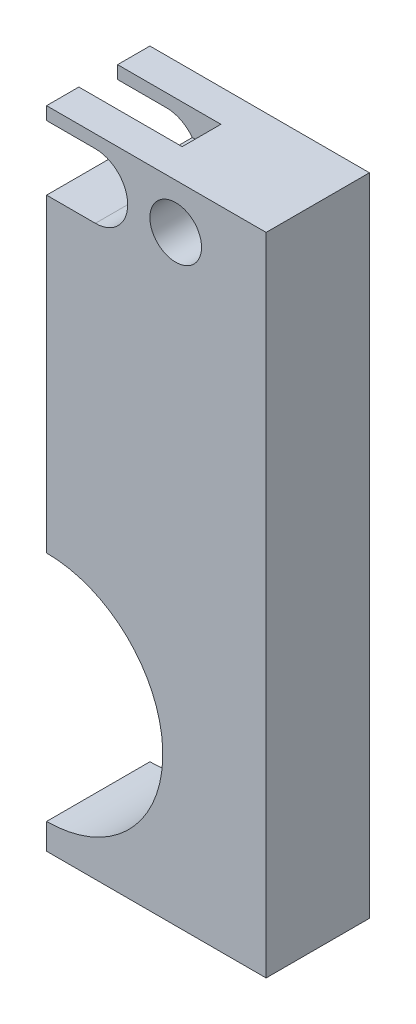
ISO-10303-21;
HEADER;
FILE_DESCRIPTION(('STEP AP214'),'2;1');
FILE_NAME('part.step','',(''),(''),'','','');
FILE_SCHEMA(('AUTOMOTIVE_DESIGN { 1 0 10303 214 1 1 1 1 }'));
ENDSEC;
DATA;
#1=APPLICATION_CONTEXT('core data for automotive mechanical design processes');
#2=APPLICATION_PROTOCOL_DEFINITION('international standard','automotive_design',2000,#1);
#3=PRODUCT_CONTEXT('',#1,'mechanical');
#4=PRODUCT('Part','Part','',(#3));
#5=PRODUCT_RELATED_PRODUCT_CATEGORY('part','',(#4));
#6=PRODUCT_DEFINITION_FORMATION('','',#4);
#7=PRODUCT_DEFINITION_CONTEXT('part definition',#1,'design');
#8=PRODUCT_DEFINITION('design','',#6,#7);
#9=PRODUCT_DEFINITION_SHAPE('','',#8);
#10=(LENGTH_UNIT() NAMED_UNIT(*) SI_UNIT(.MILLI.,.METRE.));
#11=(NAMED_UNIT(*) PLANE_ANGLE_UNIT() SI_UNIT($,.RADIAN.));
#12=(NAMED_UNIT(*) SI_UNIT($,.STERADIAN.) SOLID_ANGLE_UNIT());
#13=UNCERTAINTY_MEASURE_WITH_UNIT(LENGTH_MEASURE(1.E-05),#10,'distance_accuracy_value','');
#14=(GEOMETRIC_REPRESENTATION_CONTEXT(3) GLOBAL_UNCERTAINTY_ASSIGNED_CONTEXT((#13)) GLOBAL_UNIT_ASSIGNED_CONTEXT((#10,
#11,#12)) REPRESENTATION_CONTEXT('',''));
#15=CARTESIAN_POINT('',(0.,0.,0.));
#16=DIRECTION('',(0.,0.,1.));
#17=DIRECTION('',(1.,0.,0.));
#18=AXIS2_PLACEMENT_3D('',#15,#16,#17);
#19=CARTESIAN_POINT('',(0.688022284122573,14.008356545961,8.));
#20=DIRECTION('',(1.,0.,0.));
#21=DIRECTION('',(0.,0.,-1.));
#22=AXIS2_PLACEMENT_3D('',#19,#20,#21);
#23=PLANE('',#22);
#24=DIRECTION('',(0.,0.,-1.));
#25=VECTOR('',#24,1.);
#26=CARTESIAN_POINT('',(0.688022284122573,13.008356545961,8.));
#27=LINE('',#26,#25);
#28=CARTESIAN_POINT('',(0.688022284122572,13.008356545961,2.5));
#29=VERTEX_POINT('',#28);
#30=CARTESIAN_POINT('',(0.688022284122573,13.008356545961,0.));
#31=VERTEX_POINT('',#30);
#32=EDGE_CURVE('E153',#29,#31,#27,.T.);
#33=ORIENTED_EDGE('',*,*,#32,.F.);
#34=DIRECTION('',(0.,1.,0.));
#35=VECTOR('',#34,1.);
#36=CARTESIAN_POINT('',(0.688022284122572,12.008356545961,2.5));
#37=LINE('',#36,#35);
#38=CARTESIAN_POINT('',(0.688022284122572,14.008356545961,2.5));
#39=VERTEX_POINT('',#38);
#40=EDGE_CURVE('E298',#29,#39,#37,.T.);
#41=ORIENTED_EDGE('',*,*,#40,.T.);
#42=DIRECTION('',(0.,0.,-1.));
#43=VECTOR('',#42,1.);
#44=CARTESIAN_POINT('',(0.688022284122573,14.008356545961,8.));
#45=LINE('',#44,#43);
#46=CARTESIAN_POINT('',(0.688022284122573,14.008356545961,0.));
#47=VERTEX_POINT('',#46);
#48=EDGE_CURVE('E208',#39,#47,#45,.T.);
#49=ORIENTED_EDGE('',*,*,#48,.T.);
#50=DIRECTION('',(0.,-1.,0.));
#51=VECTOR('',#50,1.);
#52=CARTESIAN_POINT('',(0.688022284122573,14.008356545961,0.));
#53=LINE('',#52,#51);
#54=EDGE_CURVE('E186',#47,#31,#53,.T.);
#55=ORIENTED_EDGE('',*,*,#54,.T.);
#56=EDGE_LOOP('',(#33,#41,#49,#55));
#57=FACE_BOUND('',#56,.T.);
#58=ADVANCED_FACE('F38',(#57),#23,.F.);
#59=CARTESIAN_POINT('',(0.688022284122573,13.008356545961,8.));
#60=DIRECTION('',(0.,1.,0.));
#61=DIRECTION('',(0.,0.,1.));
#62=AXIS2_PLACEMENT_3D('',#59,#60,#61);
#63=PLANE('',#62);
#64=DIRECTION('',(0.,0.,-1.));
#65=VECTOR('',#64,1.);
#66=CARTESIAN_POINT('',(4.46794823981382,13.008356545961,8.));
#67=LINE('',#66,#65);
#68=CARTESIAN_POINT('',(4.46794823981382,13.008356545961,2.5));
#69=VERTEX_POINT('',#68);
#70=CARTESIAN_POINT('',(4.46794823981382,13.008356545961,0.));
#71=VERTEX_POINT('',#70);
#72=EDGE_CURVE('E154',#69,#71,#67,.T.);
#73=ORIENTED_EDGE('',*,*,#72,.F.);
#74=DIRECTION('',(-1.,0.,0.));
#75=VECTOR('',#74,1.);
#76=CARTESIAN_POINT('',(0.688022284122571,13.008356545961,2.5));
#77=LINE('',#76,#75);
#78=EDGE_CURVE('E308',#69,#29,#77,.T.);
#79=ORIENTED_EDGE('',*,*,#78,.T.);
#80=ORIENTED_EDGE('',*,*,#32,.T.);
#81=DIRECTION('',(1.,0.,0.));
#82=VECTOR('',#81,1.);
#83=CARTESIAN_POINT('',(0.688022284122573,13.008356545961,0.));
#84=LINE('',#83,#82);
#85=EDGE_CURVE('E190',#31,#71,#84,.T.);
#86=ORIENTED_EDGE('',*,*,#85,.T.);
#87=EDGE_LOOP('',(#73,#79,#80,#86));
#88=FACE_BOUND('',#87,.T.);
#89=ADVANCED_FACE('F352',(#88),#63,.F.);
#90=CARTESIAN_POINT('',(0.688022284122573,7.008356545961,8.));
#91=DIRECTION('',(1.,0.,0.));
#92=DIRECTION('',(0.,1.,0.));
#93=AXIS2_PLACEMENT_3D('',#90,#91,#92);
#94=PLANE('',#93);
#95=DIRECTION('',(0.,-1.,0.));
#96=VECTOR('',#95,1.);
#97=CARTESIAN_POINT('',(0.688022284122573,7.008356545961,0.));
#98=LINE('',#97,#96);
#99=CARTESIAN_POINT('',(0.688022284122573,8.008356545961,0.));
#100=VERTEX_POINT('',#99);
#101=CARTESIAN_POINT('',(0.688022284122576,-15.991643454039,0.));
#102=VERTEX_POINT('',#101);
#103=EDGE_CURVE('E102',#100,#102,#98,.T.);
#104=ORIENTED_EDGE('',*,*,#103,.T.);
#105=DIRECTION('',(0.,0.,-1.));
#106=VECTOR('',#105,1.);
#107=CARTESIAN_POINT('',(0.688022284122576,-15.991643454039,8.));
#108=LINE('',#107,#106);
#109=CARTESIAN_POINT('',(0.688022284122576,-15.991643454039,8.));
#110=VERTEX_POINT('',#109);
#111=EDGE_CURVE('E229',#110,#102,#108,.T.);
#112=ORIENTED_EDGE('',*,*,#111,.F.);
#113=DIRECTION('',(0.,-1.,0.));
#114=VECTOR('',#113,1.);
#115=CARTESIAN_POINT('',(0.688022284122573,8.008356545961,8.));
#116=LINE('',#115,#114);
#117=CARTESIAN_POINT('',(0.688022284122573,8.008356545961,8.));
#118=VERTEX_POINT('',#117);
#119=EDGE_CURVE('E108',#118,#110,#116,.T.);
#120=ORIENTED_EDGE('',*,*,#119,.F.);
#121=DIRECTION('',(0.,0.,-1.));
#122=VECTOR('',#121,1.);
#123=CARTESIAN_POINT('',(0.688022284122573,8.008356545961,8.));
#124=LINE('',#123,#122);
#125=EDGE_CURVE('E163',#118,#100,#124,.T.);
#126=ORIENTED_EDGE('',*,*,#125,.T.);
#127=EDGE_LOOP('',(#104,#112,#120,#126));
#128=FACE_BOUND('',#127,.T.);
#129=ADVANCED_FACE('F40',(#128),#94,.F.);
#130=CARTESIAN_POINT('',(0.688022284122576,-24.991643454039,8.));
#131=DIRECTION('',(0.,0.,-1.));
#132=DIRECTION('',(-1.,0.,0.));
#133=AXIS2_PLACEMENT_3D('',#130,#131,#132);
#134=CYLINDRICAL_SURFACE('',#133,9.);
#135=CARTESIAN_POINT('',(0.688022284122576,-24.991643454039,0.));
#136=DIRECTION('',(0.,0.,-1.));
#137=DIRECTION('',(-1.,0.,0.));
#138=AXIS2_PLACEMENT_3D('',#135,#136,#137);
#139=CIRCLE('',#138,9.);
#140=CARTESIAN_POINT('',(0.688022284122578,-33.991643454039,0.));
#141=VERTEX_POINT('',#140);
#142=EDGE_CURVE('E169',#102,#141,#139,.T.);
#143=ORIENTED_EDGE('',*,*,#142,.T.);
#144=DIRECTION('',(0.,0.,-1.));
#145=VECTOR('',#144,1.);
#146=CARTESIAN_POINT('',(0.688022284122578,-33.991643454039,8.));
#147=LINE('',#146,#145);
#148=CARTESIAN_POINT('',(0.688022284122578,-33.991643454039,8.));
#149=VERTEX_POINT('',#148);
#150=EDGE_CURVE('E225',#149,#141,#147,.T.);
#151=ORIENTED_EDGE('',*,*,#150,.F.);
#152=CARTESIAN_POINT('',(0.688022284122576,-24.991643454039,8.));
#153=DIRECTION('',(0.,0.,-1.));
#154=DIRECTION('',(-1.,0.,0.));
#155=AXIS2_PLACEMENT_3D('',#152,#153,#154);
#156=CIRCLE('',#155,9.);
#157=EDGE_CURVE('E321',#110,#149,#156,.T.);
#158=ORIENTED_EDGE('',*,*,#157,.F.);
#159=ORIENTED_EDGE('',*,*,#111,.T.);
#160=EDGE_LOOP('',(#143,#151,#158,#159));
#161=FACE_BOUND('',#160,.T.);
#162=ADVANCED_FACE('F377',(#161),#134,.F.);
#163=CARTESIAN_POINT('',(0.688022284122578,-33.991643454039,8.));
#164=DIRECTION('',(1.,0.,0.));
#165=DIRECTION('',(0.,0.,-1.));
#166=AXIS2_PLACEMENT_3D('',#163,#164,#165);
#167=PLANE('',#166);
#168=DIRECTION('',(0.,-1.,0.));
#169=VECTOR('',#168,1.);
#170=CARTESIAN_POINT('',(0.688022284122578,-33.991643454039,0.));
#171=LINE('',#170,#169);
#172=CARTESIAN_POINT('',(0.688022284122578,-35.991643454039,0.));
#173=VERTEX_POINT('',#172);
#174=EDGE_CURVE('E173',#141,#173,#171,.T.);
#175=ORIENTED_EDGE('',*,*,#174,.T.);
#176=DIRECTION('',(0.,0.,-1.));
#177=VECTOR('',#176,1.);
#178=CARTESIAN_POINT('',(0.688022284122578,-35.991643454039,8.));
#179=LINE('',#178,#177);
#180=CARTESIAN_POINT('',(0.688022284122578,-35.991643454039,8.));
#181=VERTEX_POINT('',#180);
#182=EDGE_CURVE('E221',#181,#173,#179,.T.);
#183=ORIENTED_EDGE('',*,*,#182,.F.);
#184=DIRECTION('',(0.,-1.,0.));
#185=VECTOR('',#184,1.);
#186=CARTESIAN_POINT('',(0.688022284122578,-33.991643454039,8.));
#187=LINE('',#186,#185);
#188=EDGE_CURVE('E324',#149,#181,#187,.T.);
#189=ORIENTED_EDGE('',*,*,#188,.F.);
#190=ORIENTED_EDGE('',*,*,#150,.T.);
#191=EDGE_LOOP('',(#175,#183,#189,#190));
#192=FACE_BOUND('',#191,.T.);
#193=ADVANCED_FACE('F383',(#192),#167,.F.);
#194=CARTESIAN_POINT('',(0.688022284122578,-35.991643454039,8.));
#195=DIRECTION('',(0.,1.,0.));
#196=DIRECTION('',(-1.,0.,0.));
#197=AXIS2_PLACEMENT_3D('',#194,#195,#196);
#198=PLANE('',#197);
#199=DIRECTION('',(1.,0.,0.));
#200=VECTOR('',#199,1.);
#201=CARTESIAN_POINT('',(0.688022284122578,-35.991643454039,0.));
#202=LINE('',#201,#200);
#203=CARTESIAN_POINT('',(17.6880222841226,-35.991643454039,0.));
#204=VERTEX_POINT('',#203);
#205=EDGE_CURVE('E176',#173,#204,#202,.T.);
#206=ORIENTED_EDGE('',*,*,#205,.T.);
#207=DIRECTION('',(0.,0.,-1.));
#208=VECTOR('',#207,1.);
#209=CARTESIAN_POINT('',(17.6880222841226,-35.991643454039,8.));
#210=LINE('',#209,#208);
#211=CARTESIAN_POINT('',(17.6880222841226,-35.991643454039,8.));
#212=VERTEX_POINT('',#211);
#213=EDGE_CURVE('E217',#212,#204,#210,.T.);
#214=ORIENTED_EDGE('',*,*,#213,.F.);
#215=DIRECTION('',(1.,0.,0.));
#216=VECTOR('',#215,1.);
#217=CARTESIAN_POINT('',(0.688022284122578,-35.991643454039,8.));
#218=LINE('',#217,#216);
#219=EDGE_CURVE('E327',#181,#212,#218,.T.);
#220=ORIENTED_EDGE('',*,*,#219,.F.);
#221=ORIENTED_EDGE('',*,*,#182,.T.);
#222=EDGE_LOOP('',(#206,#214,#220,#221));
#223=FACE_BOUND('',#222,.T.);
#224=ADVANCED_FACE('F387',(#223),#198,.F.);
#225=CARTESIAN_POINT('',(17.6880222841226,-35.991643454039,8.));
#226=DIRECTION('',(-1.,0.,0.));
#227=DIRECTION('',(0.,-1.,0.));
#228=AXIS2_PLACEMENT_3D('',#225,#226,#227);
#229=PLANE('',#228);
#230=DIRECTION('',(0.,1.,0.));
#231=VECTOR('',#230,1.);
#232=CARTESIAN_POINT('',(17.6880222841226,-35.991643454039,0.));
#233=LINE('',#232,#231);
#234=CARTESIAN_POINT('',(17.6880222841226,14.008356545961,0.));
#235=VERTEX_POINT('',#234);
#236=EDGE_CURVE('E179',#204,#235,#233,.T.);
#237=ORIENTED_EDGE('',*,*,#236,.T.);
#238=DIRECTION('',(0.,0.,-1.));
#239=VECTOR('',#238,1.);
#240=CARTESIAN_POINT('',(17.6880222841226,14.008356545961,8.));
#241=LINE('',#240,#239);
#242=CARTESIAN_POINT('',(17.6880222841226,14.008356545961,8.));
#243=VERTEX_POINT('',#242);
#244=EDGE_CURVE('E213',#243,#235,#241,.T.);
#245=ORIENTED_EDGE('',*,*,#244,.F.);
#246=DIRECTION('',(0.,1.,0.));
#247=VECTOR('',#246,1.);
#248=CARTESIAN_POINT('',(17.6880222841226,-35.991643454039,8.));
#249=LINE('',#248,#247);
#250=EDGE_CURVE('E330',#212,#243,#249,.T.);
#251=ORIENTED_EDGE('',*,*,#250,.F.);
#252=ORIENTED_EDGE('',*,*,#213,.T.);
#253=EDGE_LOOP('',(#237,#245,#251,#252));
#254=FACE_BOUND('',#253,.T.);
#255=ADVANCED_FACE('F353',(#254),#229,.F.);
#256=CARTESIAN_POINT('',(0.688022284122573,14.008356545961,8.));
#257=DIRECTION('',(0.,-1.,0.));
#258=DIRECTION('',(1.,0.,0.));
#259=AXIS2_PLACEMENT_3D('',#256,#257,#258);
#260=PLANE('',#259);
#261=ORIENTED_EDGE('',*,*,#48,.F.);
#262=DIRECTION('',(-1.,0.,0.));
#263=VECTOR('',#262,1.);
#264=CARTESIAN_POINT('',(0.688022284122572,14.008356545961,2.5));
#265=LINE('',#264,#263);
#266=CARTESIAN_POINT('',(8.68802228412257,14.008356545961,2.5));
#267=VERTEX_POINT('',#266);
#268=EDGE_CURVE('E272',#267,#39,#265,.T.);
#269=ORIENTED_EDGE('',*,*,#268,.F.);
#270=DIRECTION('',(0.,0.,-1.));
#271=VECTOR('',#270,1.);
#272=CARTESIAN_POINT('',(8.68802228412257,14.008356545961,2.5));
#273=LINE('',#272,#271);
#274=CARTESIAN_POINT('',(8.68802228412257,14.008356545961,5.5));
#275=VERTEX_POINT('',#274);
#276=EDGE_CURVE('E293',#275,#267,#273,.T.);
#277=ORIENTED_EDGE('',*,*,#276,.F.);
#278=DIRECTION('',(1.,0.,0.));
#279=VECTOR('',#278,1.);
#280=CARTESIAN_POINT('',(8.68802228412257,14.008356545961,5.5));
#281=LINE('',#280,#279);
#282=CARTESIAN_POINT('',(0.688022284122572,14.008356545961,5.5));
#283=VERTEX_POINT('',#282);
#284=EDGE_CURVE('E277',#283,#275,#281,.T.);
#285=ORIENTED_EDGE('',*,*,#284,.F.);
#286=CARTESIAN_POINT('',(0.688022284122573,14.008356545961,8.));
#287=VERTEX_POINT('',#286);
#288=EDGE_CURVE('E209',#287,#283,#45,.T.);
#289=ORIENTED_EDGE('',*,*,#288,.F.);
#290=DIRECTION('',(-1.,0.,0.));
#291=VECTOR('',#290,1.);
#292=CARTESIAN_POINT('',(0.688022284122573,14.008356545961,8.));
#293=LINE('',#292,#291);
#294=EDGE_CURVE('E333',#243,#287,#293,.T.);
#295=ORIENTED_EDGE('',*,*,#294,.F.);
#296=ORIENTED_EDGE('',*,*,#244,.T.);
#297=DIRECTION('',(-1.,0.,0.));
#298=VECTOR('',#297,1.);
#299=CARTESIAN_POINT('',(0.688022284122573,14.008356545961,0.));
#300=LINE('',#299,#298);
#301=EDGE_CURVE('E182',#235,#47,#300,.T.);
#302=ORIENTED_EDGE('',*,*,#301,.T.);
#303=EDGE_LOOP('',(#261,#269,#277,#285,#289,#295,#296,#302));
#304=FACE_BOUND('',#303,.T.);
#305=ADVANCED_FACE('F342',(#304),#260,.F.);
#306=ORIENTED_EDGE('',*,*,#288,.T.);
#307=DIRECTION('',(0.,1.,0.));
#308=VECTOR('',#307,1.);
#309=CARTESIAN_POINT('',(0.688022284122573,12.008356545961,5.5));
#310=LINE('',#309,#308);
#311=CARTESIAN_POINT('',(0.688022284122573,13.008356545961,5.5));
#312=VERTEX_POINT('',#311);
#313=EDGE_CURVE('E283',#312,#283,#310,.T.);
#314=ORIENTED_EDGE('',*,*,#313,.F.);
#315=CARTESIAN_POINT('',(0.688022284122573,13.008356545961,8.));
#316=VERTEX_POINT('',#315);
#317=EDGE_CURVE('E205',#316,#312,#27,.T.);
#318=ORIENTED_EDGE('',*,*,#317,.F.);
#319=DIRECTION('',(0.,-1.,0.));
#320=VECTOR('',#319,1.);
#321=CARTESIAN_POINT('',(0.688022284122573,14.008356545961,8.));
#322=LINE('',#321,#320);
#323=EDGE_CURVE('E137',#287,#316,#322,.T.);
#324=ORIENTED_EDGE('',*,*,#323,.F.);
#325=EDGE_LOOP('',(#306,#314,#318,#324));
#326=FACE_BOUND('',#325,.T.);
#327=ADVANCED_FACE('F344',(#326),#23,.F.);
#328=ORIENTED_EDGE('',*,*,#317,.T.);
#329=DIRECTION('',(1.,0.,0.));
#330=VECTOR('',#329,1.);
#331=CARTESIAN_POINT('',(0.688022284122572,13.008356545961,5.5));
#332=LINE('',#331,#330);
#333=CARTESIAN_POINT('',(4.46794823981382,13.008356545961,5.5));
#334=VERTEX_POINT('',#333);
#335=EDGE_CURVE('E149',#312,#334,#332,.T.);
#336=ORIENTED_EDGE('',*,*,#335,.T.);
#337=CARTESIAN_POINT('',(4.46794823981382,13.008356545961,8.));
#338=VERTEX_POINT('',#337);
#339=EDGE_CURVE('E145',#338,#334,#67,.T.);
#340=ORIENTED_EDGE('',*,*,#339,.F.);
#341=DIRECTION('',(1.,0.,0.));
#342=VECTOR('',#341,1.);
#343=CARTESIAN_POINT('',(0.688022284122573,13.008356545961,8.));
#344=LINE('',#343,#342);
#345=EDGE_CURVE('E130',#316,#338,#344,.T.);
#346=ORIENTED_EDGE('',*,*,#345,.F.);
#347=EDGE_LOOP('',(#328,#336,#340,#346));
#348=FACE_BOUND('',#347,.T.);
#349=ADVANCED_FACE('F146',(#348),#63,.F.);
#350=CARTESIAN_POINT('',(4.46794823981382,10.508356545961,8.));
#351=DIRECTION('',(0.,0.,-1.));
#352=DIRECTION('',(-1.,0.,0.));
#353=AXIS2_PLACEMENT_3D('',#350,#351,#352);
#354=CYLINDRICAL_SURFACE('',#353,2.5);
#355=DIRECTION('',(0.,0.,-1.));
#356=VECTOR('',#355,1.);
#357=CARTESIAN_POINT('',(6.46794823981382,12.008356545961,8.));
#358=LINE('',#357,#356);
#359=CARTESIAN_POINT('',(6.46794823981382,12.008356545961,5.5));
#360=VERTEX_POINT('',#359);
#361=CARTESIAN_POINT('',(6.46794823981382,12.008356545961,2.5));
#362=VERTEX_POINT('',#361);
#363=EDGE_CURVE('E233',#360,#362,#358,.T.);
#364=ORIENTED_EDGE('',*,*,#363,.T.);
#365=CARTESIAN_POINT('',(4.46794823981382,10.508356545961,2.5));
#366=DIRECTION('',(0.,0.,-1.));
#367=DIRECTION('',(-1.,0.,0.));
#368=AXIS2_PLACEMENT_3D('',#365,#366,#367);
#369=CIRCLE('',#368,2.5);
#370=EDGE_CURVE('E11',#362,#69,#369,.F.);
#371=ORIENTED_EDGE('',*,*,#370,.T.);
#372=ORIENTED_EDGE('',*,*,#72,.T.);
#373=CARTESIAN_POINT('',(4.46794823981382,10.508356545961,0.));
#374=DIRECTION('',(0.,0.,-1.));
#375=DIRECTION('',(1.,0.,0.));
#376=AXIS2_PLACEMENT_3D('',#373,#374,#375);
#377=CIRCLE('',#376,2.5);
#378=CARTESIAN_POINT('',(4.46794823981382,8.008356545961,0.));
#379=VERTEX_POINT('',#378);
#380=EDGE_CURVE('E194',#71,#379,#377,.T.);
#381=ORIENTED_EDGE('',*,*,#380,.T.);
#382=DIRECTION('',(0.,0.,-1.));
#383=VECTOR('',#382,1.);
#384=CARTESIAN_POINT('',(4.46794823981382,8.008356545961,8.));
#385=LINE('',#384,#383);
#386=CARTESIAN_POINT('',(4.46794823981382,8.008356545961,8.));
#387=VERTEX_POINT('',#386);
#388=EDGE_CURVE('E159',#387,#379,#385,.T.);
#389=ORIENTED_EDGE('',*,*,#388,.F.);
#390=CARTESIAN_POINT('',(4.46794823981382,10.508356545961,8.));
#391=DIRECTION('',(0.,0.,-1.));
#392=DIRECTION('',(1.,0.,0.));
#393=AXIS2_PLACEMENT_3D('',#390,#391,#392);
#394=CIRCLE('',#393,2.5);
#395=EDGE_CURVE('E134',#338,#387,#394,.T.);
#396=ORIENTED_EDGE('',*,*,#395,.F.);
#397=ORIENTED_EDGE('',*,*,#339,.T.);
#398=CARTESIAN_POINT('',(4.46794823981382,10.508356545961,5.5));
#399=DIRECTION('',(0.,0.,1.));
#400=DIRECTION('',(1.,0.,0.));
#401=AXIS2_PLACEMENT_3D('',#398,#399,#400);
#402=CIRCLE('',#401,2.5);
#403=EDGE_CURVE('E47',#334,#360,#402,.F.);
#404=ORIENTED_EDGE('',*,*,#403,.T.);
#405=EDGE_LOOP('',(#364,#371,#372,#381,#389,#396,#397,#404));
#406=FACE_BOUND('',#405,.T.);
#407=ADVANCED_FACE('F157',(#406),#354,.F.);
#408=CARTESIAN_POINT('',(4.46794823981382,8.008356545961,8.));
#409=DIRECTION('',(0.,-1.,0.));
#410=DIRECTION('',(1.,0.,0.));
#411=AXIS2_PLACEMENT_3D('',#408,#409,#410);
#412=PLANE('',#411);
#413=DIRECTION('',(-1.,0.,0.));
#414=VECTOR('',#413,1.);
#415=CARTESIAN_POINT('',(4.46794823981382,8.008356545961,0.));
#416=LINE('',#415,#414);
#417=EDGE_CURVE('E197',#379,#100,#416,.T.);
#418=ORIENTED_EDGE('',*,*,#417,.T.);
#419=ORIENTED_EDGE('',*,*,#125,.F.);
#420=DIRECTION('',(-1.,0.,0.));
#421=VECTOR('',#420,1.);
#422=CARTESIAN_POINT('',(4.46794823981382,8.008356545961,8.));
#423=LINE('',#422,#421);
#424=EDGE_CURVE('E63',#387,#118,#423,.T.);
#425=ORIENTED_EDGE('',*,*,#424,.F.);
#426=ORIENTED_EDGE('',*,*,#388,.T.);
#427=EDGE_LOOP('',(#418,#419,#425,#426));
#428=FACE_BOUND('',#427,.T.);
#429=ADVANCED_FACE('F372',(#428),#412,.F.);
#430=CARTESIAN_POINT('',(0.688022284122576,-24.991643454039,8.));
#431=DIRECTION('',(0.,0.,-1.));
#432=DIRECTION('',(-1.,0.,0.));
#433=AXIS2_PLACEMENT_3D('',#430,#431,#432);
#434=PLANE('',#433);
#435=CARTESIAN_POINT('',(10.6880222841226,10.508356545961,8.));
#436=DIRECTION('',(0.,0.,1.));
#437=DIRECTION('',(1.,0.,0.));
#438=AXIS2_PLACEMENT_3D('',#435,#436,#437);
#439=CIRCLE('',#438,2.);
#440=CARTESIAN_POINT('',(12.6880222841226,10.508356545961,8.));
#441=VERTEX_POINT('',#440);
#442=EDGE_CURVE('E312',#441,#441,#439,.T.);
#443=ORIENTED_EDGE('',*,*,#442,.F.);
#444=EDGE_LOOP('',(#443));
#445=FACE_BOUND('',#444,.T.);
#446=ORIENTED_EDGE('',*,*,#119,.T.);
#447=ORIENTED_EDGE('',*,*,#157,.T.);
#448=ORIENTED_EDGE('',*,*,#188,.T.);
#449=ORIENTED_EDGE('',*,*,#219,.T.);
#450=ORIENTED_EDGE('',*,*,#250,.T.);
#451=ORIENTED_EDGE('',*,*,#294,.T.);
#452=ORIENTED_EDGE('',*,*,#323,.T.);
#453=ORIENTED_EDGE('',*,*,#345,.T.);
#454=ORIENTED_EDGE('',*,*,#395,.T.);
#455=ORIENTED_EDGE('',*,*,#424,.T.);
#456=EDGE_LOOP('',(#446,#447,#448,#449,#450,#451,#452,#453,#454,#455));
#457=FACE_BOUND('',#456,.T.);
#458=ADVANCED_FACE('F132',(#445,#457),#434,.F.);
#459=CARTESIAN_POINT('',(0.688022284122576,-24.991643454039,0.));
#460=DIRECTION('',(0.,0.,-1.));
#461=DIRECTION('',(-1.,0.,0.));
#462=AXIS2_PLACEMENT_3D('',#459,#460,#461);
#463=PLANE('',#462);
#464=CARTESIAN_POINT('',(10.6880222841226,10.508356545961,0.));
#465=DIRECTION('',(0.,0.,1.));
#466=DIRECTION('',(1.,0.,0.));
#467=AXIS2_PLACEMENT_3D('',#464,#465,#466);
#468=CIRCLE('',#467,2.);
#469=CARTESIAN_POINT('',(12.6880222841226,10.508356545961,0.));
#470=VERTEX_POINT('',#469);
#471=EDGE_CURVE('E170',#470,#470,#468,.T.);
#472=ORIENTED_EDGE('',*,*,#471,.T.);
#473=EDGE_LOOP('',(#472));
#474=FACE_BOUND('',#473,.T.);
#475=ORIENTED_EDGE('',*,*,#103,.F.);
#476=ORIENTED_EDGE('',*,*,#417,.F.);
#477=ORIENTED_EDGE('',*,*,#380,.F.);
#478=ORIENTED_EDGE('',*,*,#85,.F.);
#479=ORIENTED_EDGE('',*,*,#54,.F.);
#480=ORIENTED_EDGE('',*,*,#301,.F.);
#481=ORIENTED_EDGE('',*,*,#236,.F.);
#482=ORIENTED_EDGE('',*,*,#205,.F.);
#483=ORIENTED_EDGE('',*,*,#174,.F.);
#484=ORIENTED_EDGE('',*,*,#142,.F.);
#485=EDGE_LOOP('',(#475,#476,#477,#478,#479,#480,#481,#482,#483,#484));
#486=FACE_BOUND('',#485,.T.);
#487=ADVANCED_FACE('F370',(#474,#486),#463,.T.);
#488=CARTESIAN_POINT('',(10.6880222841226,10.508356545961,0.));
#489=DIRECTION('',(0.,0.,1.));
#490=DIRECTION('',(1.,0.,0.));
#491=AXIS2_PLACEMENT_3D('',#488,#489,#490);
#492=CYLINDRICAL_SURFACE('',#491,2.);
#493=ORIENTED_EDGE('',*,*,#471,.F.);
#494=EDGE_LOOP('',(#493));
#495=FACE_BOUND('',#494,.T.);
#496=ORIENTED_EDGE('',*,*,#442,.T.);
#497=EDGE_LOOP('',(#496));
#498=FACE_BOUND('',#497,.T.);
#499=ADVANCED_FACE('F396',(#495,#498),#492,.F.);
#500=CARTESIAN_POINT('',(0.688022284122572,12.008356545961,2.5));
#501=DIRECTION('',(0.,0.,-1.));
#502=DIRECTION('',(-1.,0.,0.));
#503=AXIS2_PLACEMENT_3D('',#500,#501,#502);
#504=PLANE('',#503);
#505=ORIENTED_EDGE('',*,*,#370,.F.);
#506=DIRECTION('',(-1.,0.,0.));
#507=VECTOR('',#506,1.);
#508=CARTESIAN_POINT('',(0.688022284122572,12.008356545961,2.5));
#509=LINE('',#508,#507);
#510=CARTESIAN_POINT('',(8.68802228412257,12.008356545961,2.5));
#511=VERTEX_POINT('',#510);
#512=EDGE_CURVE('E54',#511,#362,#509,.T.);
#513=ORIENTED_EDGE('',*,*,#512,.F.);
#514=DIRECTION('',(0.,1.,0.));
#515=VECTOR('',#514,1.);
#516=CARTESIAN_POINT('',(8.68802228412257,12.008356545961,2.5));
#517=LINE('',#516,#515);
#518=EDGE_CURVE('E282',#511,#267,#517,.T.);
#519=ORIENTED_EDGE('',*,*,#518,.T.);
#520=ORIENTED_EDGE('',*,*,#268,.T.);
#521=ORIENTED_EDGE('',*,*,#40,.F.);
#522=ORIENTED_EDGE('',*,*,#78,.F.);
#523=EDGE_LOOP('',(#505,#513,#519,#520,#521,#522));
#524=FACE_BOUND('',#523,.T.);
#525=ADVANCED_FACE('F393',(#524),#504,.F.);
#526=CARTESIAN_POINT('',(8.68802228412257,12.008356545961,5.5));
#527=DIRECTION('',(0.,0.,1.));
#528=DIRECTION('',(1.,0.,0.));
#529=AXIS2_PLACEMENT_3D('',#526,#527,#528);
#530=PLANE('',#529);
#531=ORIENTED_EDGE('',*,*,#313,.T.);
#532=ORIENTED_EDGE('',*,*,#284,.T.);
#533=DIRECTION('',(0.,1.,0.));
#534=VECTOR('',#533,1.);
#535=CARTESIAN_POINT('',(8.68802228412257,12.008356545961,5.5));
#536=LINE('',#535,#534);
#537=CARTESIAN_POINT('',(8.68802228412257,12.008356545961,5.5));
#538=VERTEX_POINT('',#537);
#539=EDGE_CURVE('E275',#538,#275,#536,.T.);
#540=ORIENTED_EDGE('',*,*,#539,.F.);
#541=DIRECTION('',(1.,0.,0.));
#542=VECTOR('',#541,1.);
#543=CARTESIAN_POINT('',(8.68802228412257,12.008356545961,5.5));
#544=LINE('',#543,#542);
#545=EDGE_CURVE('E248',#360,#538,#544,.T.);
#546=ORIENTED_EDGE('',*,*,#545,.F.);
#547=ORIENTED_EDGE('',*,*,#403,.F.);
#548=ORIENTED_EDGE('',*,*,#335,.F.);
#549=EDGE_LOOP('',(#531,#532,#540,#546,#547,#548));
#550=FACE_BOUND('',#549,.T.);
#551=ADVANCED_FACE('F244',(#550),#530,.F.);
#552=CARTESIAN_POINT('',(0.,12.008356545961,0.));
#553=DIRECTION('',(0.,-1.,0.));
#554=DIRECTION('',(1.,0.,0.));
#555=AXIS2_PLACEMENT_3D('',#552,#553,#554);
#556=PLANE('',#555);
#557=ORIENTED_EDGE('',*,*,#545,.T.);
#558=DIRECTION('',(0.,0.,-1.));
#559=VECTOR('',#558,1.);
#560=CARTESIAN_POINT('',(8.68802228412257,12.008356545961,2.5));
#561=LINE('',#560,#559);
#562=EDGE_CURVE('E270',#538,#511,#561,.T.);
#563=ORIENTED_EDGE('',*,*,#562,.T.);
#564=ORIENTED_EDGE('',*,*,#512,.T.);
#565=ORIENTED_EDGE('',*,*,#363,.F.);
#566=EDGE_LOOP('',(#557,#563,#564,#565));
#567=FACE_BOUND('',#566,.T.);
#568=ADVANCED_FACE('F268',(#567),#556,.F.);
#569=CARTESIAN_POINT('',(8.68802228412257,12.008356545961,2.5));
#570=DIRECTION('',(1.,0.,0.));
#571=DIRECTION('',(0.,0.,-1.));
#572=AXIS2_PLACEMENT_3D('',#569,#570,#571);
#573=PLANE('',#572);
#574=ORIENTED_EDGE('',*,*,#276,.T.);
#575=ORIENTED_EDGE('',*,*,#518,.F.);
#576=ORIENTED_EDGE('',*,*,#562,.F.);
#577=ORIENTED_EDGE('',*,*,#539,.T.);
#578=EDGE_LOOP('',(#574,#575,#576,#577));
#579=FACE_BOUND('',#578,.T.);
#580=ADVANCED_FACE('F285',(#579),#573,.F.);
#581=CLOSED_SHELL('',(#58,#89,#129,#162,#193,#224,#255,#305,#327,#349,#407,#429,#458,#487,#499,
#525,#551,#568,#580));
#582=MANIFOLD_SOLID_BREP('B2',#581);
#583=ADVANCED_BREP_SHAPE_REPRESENTATION('',(#18,#582),#14);
#584=SHAPE_DEFINITION_REPRESENTATION(#9,#583);
ENDSEC;
END-ISO-10303-21;
